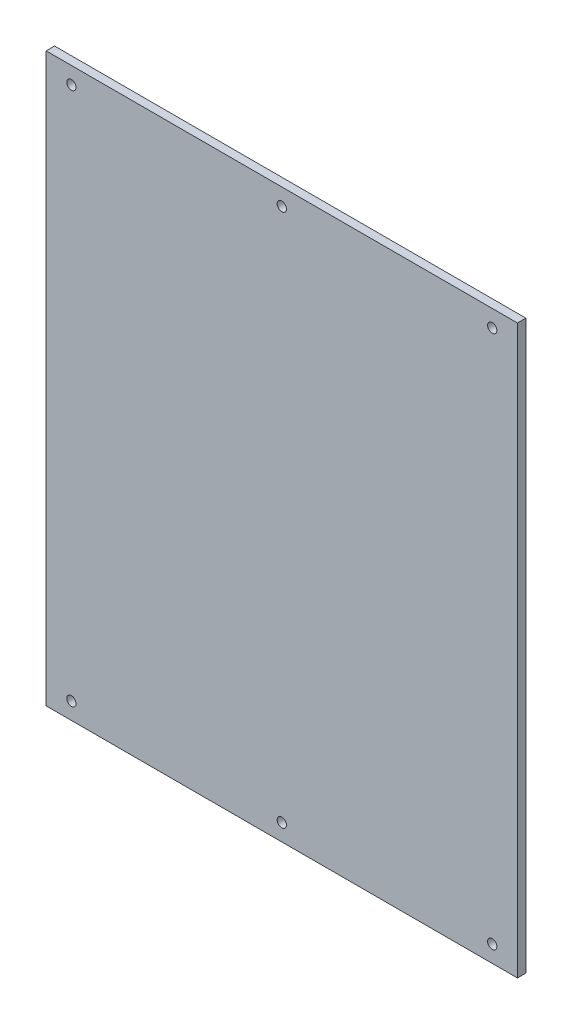
ISO-10303-21;
HEADER;
FILE_DESCRIPTION(('STEP AP214'),'2;1');
FILE_NAME('part.step','',(''),(''),'','','');
FILE_SCHEMA(('AUTOMOTIVE_DESIGN { 1 0 10303 214 1 1 1 1 }'));
ENDSEC;
DATA;
#1=APPLICATION_CONTEXT('core data for automotive mechanical design processes');
#2=APPLICATION_PROTOCOL_DEFINITION('international standard','automotive_design',2000,#1);
#3=PRODUCT_CONTEXT('',#1,'mechanical');
#4=PRODUCT('Part','Part','',(#3));
#5=PRODUCT_RELATED_PRODUCT_CATEGORY('part','',(#4));
#6=PRODUCT_DEFINITION_FORMATION('','',#4);
#7=PRODUCT_DEFINITION_CONTEXT('part definition',#1,'design');
#8=PRODUCT_DEFINITION('design','',#6,#7);
#9=PRODUCT_DEFINITION_SHAPE('','',#8);
#10=(LENGTH_UNIT() NAMED_UNIT(*) SI_UNIT(.MILLI.,.METRE.));
#11=(NAMED_UNIT(*) PLANE_ANGLE_UNIT() SI_UNIT($,.RADIAN.));
#12=(NAMED_UNIT(*) SI_UNIT($,.STERADIAN.) SOLID_ANGLE_UNIT());
#13=UNCERTAINTY_MEASURE_WITH_UNIT(LENGTH_MEASURE(1.E-05),#10,'distance_accuracy_value','');
#14=(GEOMETRIC_REPRESENTATION_CONTEXT(3) GLOBAL_UNCERTAINTY_ASSIGNED_CONTEXT((#13)) GLOBAL_UNIT_ASSIGNED_CONTEXT((#10,
#11,#12)) REPRESENTATION_CONTEXT('',''));
#15=CARTESIAN_POINT('',(0.,0.,0.));
#16=DIRECTION('',(0.,0.,1.));
#17=DIRECTION('',(1.,0.,0.));
#18=AXIS2_PLACEMENT_3D('',#15,#16,#17);
#19=CARTESIAN_POINT('',(0.,0.,-2.5));
#20=DIRECTION('',(0.,0.,-1.));
#21=DIRECTION('',(-1.,0.,0.));
#22=AXIS2_PLACEMENT_3D('',#19,#20,#21);
#23=PLANE('',#22);
#24=CARTESIAN_POINT('',(0.,158.5,-2.5));
#25=DIRECTION('',(0.,0.,1.));
#26=DIRECTION('',(1.,0.,0.));
#27=AXIS2_PLACEMENT_3D('',#24,#25,#26);
#28=CIRCLE('',#27,2.75);
#29=CARTESIAN_POINT('',(2.75,158.5,-2.5));
#30=VERTEX_POINT('',#29);
#31=EDGE_CURVE('E97',#30,#30,#28,.T.);
#32=ORIENTED_EDGE('',*,*,#31,.T.);
#33=EDGE_LOOP('',(#32));
#34=FACE_BOUND('',#33,.T.);
#35=CARTESIAN_POINT('',(-125.,158.5,-2.5));
#36=DIRECTION('',(0.,0.,1.));
#37=DIRECTION('',(1.,0.,0.));
#38=AXIS2_PLACEMENT_3D('',#35,#36,#37);
#39=CIRCLE('',#38,2.75);
#40=CARTESIAN_POINT('',(-122.25,158.5,-2.5));
#41=VERTEX_POINT('',#40);
#42=EDGE_CURVE('E100',#41,#41,#39,.T.);
#43=ORIENTED_EDGE('',*,*,#42,.T.);
#44=EDGE_LOOP('',(#43));
#45=FACE_BOUND('',#44,.T.);
#46=CARTESIAN_POINT('',(125.,158.5,-2.5));
#47=DIRECTION('',(0.,0.,1.));
#48=DIRECTION('',(1.,0.,0.));
#49=AXIS2_PLACEMENT_3D('',#46,#47,#48);
#50=CIRCLE('',#49,2.75);
#51=CARTESIAN_POINT('',(127.75,158.5,-2.5));
#52=VERTEX_POINT('',#51);
#53=EDGE_CURVE('E103',#52,#52,#50,.T.);
#54=ORIENTED_EDGE('',*,*,#53,.T.);
#55=EDGE_LOOP('',(#54));
#56=FACE_BOUND('',#55,.T.);
#57=CARTESIAN_POINT('',(125.,-158.5,-2.5));
#58=DIRECTION('',(0.,0.,1.));
#59=DIRECTION('',(1.,0.,0.));
#60=AXIS2_PLACEMENT_3D('',#57,#58,#59);
#61=CIRCLE('',#60,2.75000000000003);
#62=CARTESIAN_POINT('',(127.75,-158.5,-2.5));
#63=VERTEX_POINT('',#62);
#64=EDGE_CURVE('E106',#63,#63,#61,.T.);
#65=ORIENTED_EDGE('',*,*,#64,.T.);
#66=EDGE_LOOP('',(#65));
#67=FACE_BOUND('',#66,.T.);
#68=CARTESIAN_POINT('',(-125.,-158.5,-2.5));
#69=DIRECTION('',(0.,0.,1.));
#70=DIRECTION('',(1.,0.,0.));
#71=AXIS2_PLACEMENT_3D('',#68,#69,#70);
#72=CIRCLE('',#71,2.75);
#73=CARTESIAN_POINT('',(-122.25,-158.5,-2.5));
#74=VERTEX_POINT('',#73);
#75=EDGE_CURVE('E108',#74,#74,#72,.T.);
#76=ORIENTED_EDGE('',*,*,#75,.T.);
#77=EDGE_LOOP('',(#76));
#78=FACE_BOUND('',#77,.T.);
#79=CARTESIAN_POINT('',(0.,-158.5,-2.5));
#80=DIRECTION('',(0.,0.,1.));
#81=DIRECTION('',(1.,0.,0.));
#82=AXIS2_PLACEMENT_3D('',#79,#80,#81);
#83=CIRCLE('',#82,2.75);
#84=CARTESIAN_POINT('',(2.75,-158.5,-2.5));
#85=VERTEX_POINT('',#84);
#86=EDGE_CURVE('E19',#85,#85,#83,.T.);
#87=ORIENTED_EDGE('',*,*,#86,.T.);
#88=EDGE_LOOP('',(#87));
#89=FACE_BOUND('',#88,.T.);
#90=DIRECTION('',(0.,1.,0.));
#91=VECTOR('',#90,1.);
#92=CARTESIAN_POINT('',(140.,-168.5,-2.5));
#93=LINE('',#92,#91);
#94=CARTESIAN_POINT('',(140.,168.5,-2.5));
#95=VERTEX_POINT('',#94);
#96=CARTESIAN_POINT('',(140.,-168.5,-2.5));
#97=VERTEX_POINT('',#96);
#98=EDGE_CURVE('E67',#95,#97,#93,.F.);
#99=ORIENTED_EDGE('',*,*,#98,.T.);
#100=DIRECTION('',(1.,0.,0.));
#101=VECTOR('',#100,1.);
#102=CARTESIAN_POINT('',(-140.,-168.5,-2.5));
#103=LINE('',#102,#101);
#104=CARTESIAN_POINT('',(-140.,-168.5,-2.5));
#105=VERTEX_POINT('',#104);
#106=EDGE_CURVE('E58',#97,#105,#103,.F.);
#107=ORIENTED_EDGE('',*,*,#106,.T.);
#108=DIRECTION('',(0.,1.,0.));
#109=VECTOR('',#108,1.);
#110=CARTESIAN_POINT('',(-140.,-168.5,-2.5));
#111=LINE('',#110,#109);
#112=CARTESIAN_POINT('',(-140.,168.5,-2.5));
#113=VERTEX_POINT('',#112);
#114=EDGE_CURVE('E53',#105,#113,#111,.T.);
#115=ORIENTED_EDGE('',*,*,#114,.T.);
#116=DIRECTION('',(1.,0.,0.));
#117=VECTOR('',#116,1.);
#118=CARTESIAN_POINT('',(-140.,168.5,-2.5));
#119=LINE('',#118,#117);
#120=EDGE_CURVE('E70',#113,#95,#119,.T.);
#121=ORIENTED_EDGE('',*,*,#120,.T.);
#122=EDGE_LOOP('',(#99,#107,#115,#121));
#123=FACE_BOUND('',#122,.T.);
#124=ADVANCED_FACE('F16',(#34,#45,#56,#67,#78,#89,#123),#23,.T.);
#125=CARTESIAN_POINT('',(140.,-168.5,2.5));
#126=DIRECTION('',(-1.,0.,0.));
#127=DIRECTION('',(0.,0.,1.));
#128=AXIS2_PLACEMENT_3D('',#125,#126,#127);
#129=PLANE('',#128);
#130=DIRECTION('',(0.,1.,0.));
#131=VECTOR('',#130,1.);
#132=CARTESIAN_POINT('',(140.,0.,2.5));
#133=LINE('',#132,#131);
#134=CARTESIAN_POINT('',(140.,168.5,2.5));
#135=VERTEX_POINT('',#134);
#136=CARTESIAN_POINT('',(140.,-168.5,2.5));
#137=VERTEX_POINT('',#136);
#138=EDGE_CURVE('E77',#135,#137,#133,.F.);
#139=ORIENTED_EDGE('',*,*,#138,.T.);
#140=DIRECTION('',(0.,0.,1.));
#141=VECTOR('',#140,1.);
#142=CARTESIAN_POINT('',(140.,-168.5,2.5));
#143=LINE('',#142,#141);
#144=EDGE_CURVE('E63',#137,#97,#143,.F.);
#145=ORIENTED_EDGE('',*,*,#144,.T.);
#146=ORIENTED_EDGE('',*,*,#98,.F.);
#147=DIRECTION('',(0.,0.,-1.));
#148=VECTOR('',#147,1.);
#149=CARTESIAN_POINT('',(140.,168.5,2.5));
#150=LINE('',#149,#148);
#151=EDGE_CURVE('E115',#95,#135,#150,.F.);
#152=ORIENTED_EDGE('',*,*,#151,.T.);
#153=EDGE_LOOP('',(#139,#145,#146,#152));
#154=FACE_BOUND('',#153,.T.);
#155=ADVANCED_FACE('F76',(#154),#129,.F.);
#156=CARTESIAN_POINT('',(-140.,-168.5,2.5));
#157=DIRECTION('',(0.,1.,0.));
#158=DIRECTION('',(0.,0.,1.));
#159=AXIS2_PLACEMENT_3D('',#156,#157,#158);
#160=PLANE('',#159);
#161=DIRECTION('',(-1.,0.,0.));
#162=VECTOR('',#161,1.);
#163=CARTESIAN_POINT('',(0.,-168.5,2.5));
#164=LINE('',#163,#162);
#165=CARTESIAN_POINT('',(-140.,-168.5,2.5));
#166=VERTEX_POINT('',#165);
#167=EDGE_CURVE('E122',#137,#166,#164,.T.);
#168=ORIENTED_EDGE('',*,*,#167,.T.);
#169=DIRECTION('',(0.,0.,-1.));
#170=VECTOR('',#169,1.);
#171=CARTESIAN_POINT('',(-140.,-168.5,2.5));
#172=LINE('',#171,#170);
#173=EDGE_CURVE('E65',#166,#105,#172,.T.);
#174=ORIENTED_EDGE('',*,*,#173,.T.);
#175=ORIENTED_EDGE('',*,*,#106,.F.);
#176=ORIENTED_EDGE('',*,*,#144,.F.);
#177=EDGE_LOOP('',(#168,#174,#175,#176));
#178=FACE_BOUND('',#177,.T.);
#179=ADVANCED_FACE('F61',(#178),#160,.F.);
#180=CARTESIAN_POINT('',(-140.,-168.5,2.5));
#181=DIRECTION('',(1.,0.,0.));
#182=DIRECTION('',(0.,0.,-1.));
#183=AXIS2_PLACEMENT_3D('',#180,#181,#182);
#184=PLANE('',#183);
#185=DIRECTION('',(0.,1.,0.));
#186=VECTOR('',#185,1.);
#187=CARTESIAN_POINT('',(-140.,0.,2.5));
#188=LINE('',#187,#186);
#189=CARTESIAN_POINT('',(-140.,168.5,2.5));
#190=VERTEX_POINT('',#189);
#191=EDGE_CURVE('E124',#166,#190,#188,.T.);
#192=ORIENTED_EDGE('',*,*,#191,.T.);
#193=DIRECTION('',(0.,0.,-1.));
#194=VECTOR('',#193,1.);
#195=CARTESIAN_POINT('',(-140.,168.5,2.5));
#196=LINE('',#195,#194);
#197=EDGE_CURVE('E34',#190,#113,#196,.T.);
#198=ORIENTED_EDGE('',*,*,#197,.T.);
#199=ORIENTED_EDGE('',*,*,#114,.F.);
#200=ORIENTED_EDGE('',*,*,#173,.F.);
#201=EDGE_LOOP('',(#192,#198,#199,#200));
#202=FACE_BOUND('',#201,.T.);
#203=ADVANCED_FACE('F130',(#202),#184,.F.);
#204=CARTESIAN_POINT('',(-140.,168.5,2.5));
#205=DIRECTION('',(0.,-1.,0.));
#206=DIRECTION('',(0.,0.,-1.));
#207=AXIS2_PLACEMENT_3D('',#204,#205,#206);
#208=PLANE('',#207);
#209=DIRECTION('',(-1.,0.,0.));
#210=VECTOR('',#209,1.);
#211=CARTESIAN_POINT('',(0.,168.5,2.5));
#212=LINE('',#211,#210);
#213=EDGE_CURVE('E96',#190,#135,#212,.F.);
#214=ORIENTED_EDGE('',*,*,#213,.T.);
#215=ORIENTED_EDGE('',*,*,#151,.F.);
#216=ORIENTED_EDGE('',*,*,#120,.F.);
#217=ORIENTED_EDGE('',*,*,#197,.F.);
#218=EDGE_LOOP('',(#214,#215,#216,#217));
#219=FACE_BOUND('',#218,.T.);
#220=ADVANCED_FACE('F126',(#219),#208,.F.);
#221=CARTESIAN_POINT('',(0.,-158.5,-7.5));
#222=DIRECTION('',(0.,0.,1.));
#223=DIRECTION('',(1.,0.,0.));
#224=AXIS2_PLACEMENT_3D('',#221,#222,#223);
#225=CYLINDRICAL_SURFACE('',#224,2.75);
#226=ORIENTED_EDGE('',*,*,#86,.F.);
#227=EDGE_LOOP('',(#226));
#228=FACE_BOUND('',#227,.T.);
#229=CARTESIAN_POINT('',(0.,-158.5,2.5));
#230=DIRECTION('',(0.,0.,1.));
#231=DIRECTION('',(1.,0.,0.));
#232=AXIS2_PLACEMENT_3D('',#229,#230,#231);
#233=CIRCLE('',#232,2.75);
#234=CARTESIAN_POINT('',(2.75,-158.5,2.5));
#235=VERTEX_POINT('',#234);
#236=EDGE_CURVE('E93',#235,#235,#233,.T.);
#237=ORIENTED_EDGE('',*,*,#236,.T.);
#238=EDGE_LOOP('',(#237));
#239=FACE_BOUND('',#238,.T.);
#240=ADVANCED_FACE('F138',(#228,#239),#225,.F.);
#241=CARTESIAN_POINT('',(-125.,-158.5,-7.5));
#242=DIRECTION('',(0.,0.,1.));
#243=DIRECTION('',(1.,0.,0.));
#244=AXIS2_PLACEMENT_3D('',#241,#242,#243);
#245=CYLINDRICAL_SURFACE('',#244,2.75);
#246=ORIENTED_EDGE('',*,*,#75,.F.);
#247=EDGE_LOOP('',(#246));
#248=FACE_BOUND('',#247,.T.);
#249=CARTESIAN_POINT('',(-125.,-158.5,2.5));
#250=DIRECTION('',(0.,0.,1.));
#251=DIRECTION('',(1.,0.,0.));
#252=AXIS2_PLACEMENT_3D('',#249,#250,#251);
#253=CIRCLE('',#252,2.75);
#254=CARTESIAN_POINT('',(-122.25,-158.5,2.5));
#255=VERTEX_POINT('',#254);
#256=EDGE_CURVE('E90',#255,#255,#253,.T.);
#257=ORIENTED_EDGE('',*,*,#256,.T.);
#258=EDGE_LOOP('',(#257));
#259=FACE_BOUND('',#258,.T.);
#260=ADVANCED_FACE('F164',(#248,#259),#245,.F.);
#261=CARTESIAN_POINT('',(125.,-158.5,-7.5));
#262=DIRECTION('',(0.,0.,1.));
#263=DIRECTION('',(1.,0.,0.));
#264=AXIS2_PLACEMENT_3D('',#261,#262,#263);
#265=CYLINDRICAL_SURFACE('',#264,2.75000000000003);
#266=ORIENTED_EDGE('',*,*,#64,.F.);
#267=EDGE_LOOP('',(#266));
#268=FACE_BOUND('',#267,.T.);
#269=CARTESIAN_POINT('',(125.,-158.5,2.5));
#270=DIRECTION('',(0.,0.,1.));
#271=DIRECTION('',(1.,0.,0.));
#272=AXIS2_PLACEMENT_3D('',#269,#270,#271);
#273=CIRCLE('',#272,2.75000000000003);
#274=CARTESIAN_POINT('',(127.75,-158.5,2.5));
#275=VERTEX_POINT('',#274);
#276=EDGE_CURVE('E87',#275,#275,#273,.T.);
#277=ORIENTED_EDGE('',*,*,#276,.T.);
#278=EDGE_LOOP('',(#277));
#279=FACE_BOUND('',#278,.T.);
#280=ADVANCED_FACE('F160',(#268,#279),#265,.F.);
#281=CARTESIAN_POINT('',(125.,158.5,-7.5));
#282=DIRECTION('',(0.,0.,1.));
#283=DIRECTION('',(1.,0.,0.));
#284=AXIS2_PLACEMENT_3D('',#281,#282,#283);
#285=CYLINDRICAL_SURFACE('',#284,2.75);
#286=ORIENTED_EDGE('',*,*,#53,.F.);
#287=EDGE_LOOP('',(#286));
#288=FACE_BOUND('',#287,.T.);
#289=CARTESIAN_POINT('',(125.,158.5,2.5));
#290=DIRECTION('',(0.,0.,1.));
#291=DIRECTION('',(1.,0.,0.));
#292=AXIS2_PLACEMENT_3D('',#289,#290,#291);
#293=CIRCLE('',#292,2.75);
#294=CARTESIAN_POINT('',(127.75,158.5,2.5));
#295=VERTEX_POINT('',#294);
#296=EDGE_CURVE('E84',#295,#295,#293,.T.);
#297=ORIENTED_EDGE('',*,*,#296,.T.);
#298=EDGE_LOOP('',(#297));
#299=FACE_BOUND('',#298,.T.);
#300=ADVANCED_FACE('F156',(#288,#299),#285,.F.);
#301=CARTESIAN_POINT('',(-125.,158.5,-7.5));
#302=DIRECTION('',(0.,0.,1.));
#303=DIRECTION('',(1.,0.,0.));
#304=AXIS2_PLACEMENT_3D('',#301,#302,#303);
#305=CYLINDRICAL_SURFACE('',#304,2.75);
#306=ORIENTED_EDGE('',*,*,#42,.F.);
#307=EDGE_LOOP('',(#306));
#308=FACE_BOUND('',#307,.T.);
#309=CARTESIAN_POINT('',(-125.,158.5,2.5));
#310=DIRECTION('',(0.,0.,1.));
#311=DIRECTION('',(1.,0.,0.));
#312=AXIS2_PLACEMENT_3D('',#309,#310,#311);
#313=CIRCLE('',#312,2.75);
#314=CARTESIAN_POINT('',(-122.25,158.5,2.5));
#315=VERTEX_POINT('',#314);
#316=EDGE_CURVE('E25',#315,#315,#313,.T.);
#317=ORIENTED_EDGE('',*,*,#316,.T.);
#318=EDGE_LOOP('',(#317));
#319=FACE_BOUND('',#318,.T.);
#320=ADVANCED_FACE('F148',(#308,#319),#305,.F.);
#321=CARTESIAN_POINT('',(0.,158.5,-7.5));
#322=DIRECTION('',(0.,0.,1.));
#323=DIRECTION('',(1.,0.,0.));
#324=AXIS2_PLACEMENT_3D('',#321,#322,#323);
#325=CYLINDRICAL_SURFACE('',#324,2.75);
#326=ORIENTED_EDGE('',*,*,#31,.F.);
#327=EDGE_LOOP('',(#326));
#328=FACE_BOUND('',#327,.T.);
#329=CARTESIAN_POINT('',(0.,158.5,2.5));
#330=DIRECTION('',(0.,0.,1.));
#331=DIRECTION('',(1.,0.,0.));
#332=AXIS2_PLACEMENT_3D('',#329,#330,#331);
#333=CIRCLE('',#332,2.75);
#334=CARTESIAN_POINT('',(2.75,158.5,2.5));
#335=VERTEX_POINT('',#334);
#336=EDGE_CURVE('E11',#335,#335,#333,.T.);
#337=ORIENTED_EDGE('',*,*,#336,.T.);
#338=EDGE_LOOP('',(#337));
#339=FACE_BOUND('',#338,.T.);
#340=ADVANCED_FACE('F142',(#328,#339),#325,.F.);
#341=CARTESIAN_POINT('',(0.,0.,2.5));
#342=DIRECTION('',(0.,0.,-1.));
#343=DIRECTION('',(-1.,0.,0.));
#344=AXIS2_PLACEMENT_3D('',#341,#342,#343);
#345=PLANE('',#344);
#346=ORIENTED_EDGE('',*,*,#336,.F.);
#347=EDGE_LOOP('',(#346));
#348=FACE_BOUND('',#347,.T.);
#349=ORIENTED_EDGE('',*,*,#316,.F.);
#350=EDGE_LOOP('',(#349));
#351=FACE_BOUND('',#350,.T.);
#352=ORIENTED_EDGE('',*,*,#296,.F.);
#353=EDGE_LOOP('',(#352));
#354=FACE_BOUND('',#353,.T.);
#355=ORIENTED_EDGE('',*,*,#276,.F.);
#356=EDGE_LOOP('',(#355));
#357=FACE_BOUND('',#356,.T.);
#358=ORIENTED_EDGE('',*,*,#256,.F.);
#359=EDGE_LOOP('',(#358));
#360=FACE_BOUND('',#359,.T.);
#361=ORIENTED_EDGE('',*,*,#236,.F.);
#362=EDGE_LOOP('',(#361));
#363=FACE_BOUND('',#362,.T.);
#364=ORIENTED_EDGE('',*,*,#191,.F.);
#365=ORIENTED_EDGE('',*,*,#167,.F.);
#366=ORIENTED_EDGE('',*,*,#138,.F.);
#367=ORIENTED_EDGE('',*,*,#213,.F.);
#368=EDGE_LOOP('',(#364,#365,#366,#367));
#369=FACE_BOUND('',#368,.T.);
#370=ADVANCED_FACE('F129',(#348,#351,#354,#357,#360,#363,#369),#345,.F.);
#371=CLOSED_SHELL('',(#124,#155,#179,#203,#220,#240,#260,#280,#300,#320,#340,#370));
#372=MANIFOLD_SOLID_BREP('B1',#371);
#373=ADVANCED_BREP_SHAPE_REPRESENTATION('',(#18,#372),#14);
#374=SHAPE_DEFINITION_REPRESENTATION(#9,#373);
ENDSEC;
END-ISO-10303-21;
